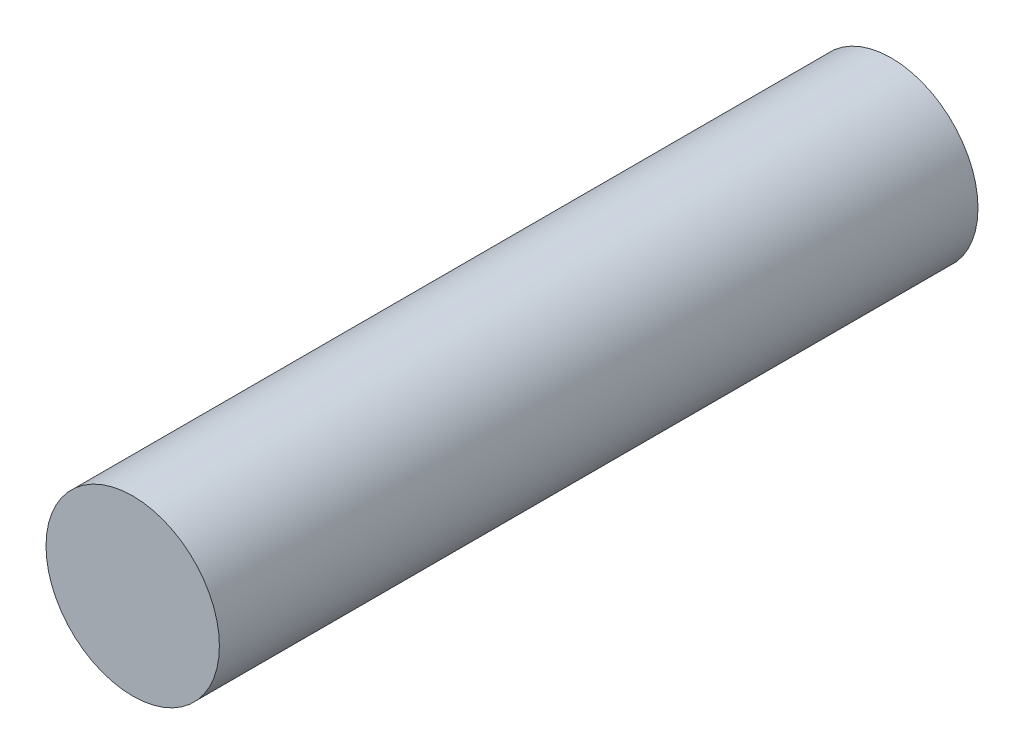
ISO-10303-21;
HEADER;
FILE_DESCRIPTION(('STEP AP214'),'2;1');
FILE_NAME('part.step','',(''),(''),'','','');
FILE_SCHEMA(('AUTOMOTIVE_DESIGN { 1 0 10303 214 1 1 1 1 }'));
ENDSEC;
DATA;
#1=APPLICATION_CONTEXT('core data for automotive mechanical design processes');
#2=APPLICATION_PROTOCOL_DEFINITION('international standard','automotive_design',2000,#1);
#3=PRODUCT_CONTEXT('',#1,'mechanical');
#4=PRODUCT('Part','Part','',(#3));
#5=PRODUCT_RELATED_PRODUCT_CATEGORY('part','',(#4));
#6=PRODUCT_DEFINITION_FORMATION('','',#4);
#7=PRODUCT_DEFINITION_CONTEXT('part definition',#1,'design');
#8=PRODUCT_DEFINITION('design','',#6,#7);
#9=PRODUCT_DEFINITION_SHAPE('','',#8);
#10=(LENGTH_UNIT() NAMED_UNIT(*) SI_UNIT(.MILLI.,.METRE.));
#11=(NAMED_UNIT(*) PLANE_ANGLE_UNIT() SI_UNIT($,.RADIAN.));
#12=(NAMED_UNIT(*) SI_UNIT($,.STERADIAN.) SOLID_ANGLE_UNIT());
#13=UNCERTAINTY_MEASURE_WITH_UNIT(LENGTH_MEASURE(1.E-05),#10,'distance_accuracy_value','');
#14=(GEOMETRIC_REPRESENTATION_CONTEXT(3) GLOBAL_UNCERTAINTY_ASSIGNED_CONTEXT((#13)) GLOBAL_UNIT_ASSIGNED_CONTEXT((#10,
#11,#12)) REPRESENTATION_CONTEXT('',''));
#15=CARTESIAN_POINT('',(0.,0.,0.));
#16=DIRECTION('',(0.,0.,1.));
#17=DIRECTION('',(1.,0.,0.));
#18=AXIS2_PLACEMENT_3D('',#15,#16,#17);
#19=CARTESIAN_POINT('',(0.,0.,35.));
#20=DIRECTION('',(0.,0.,-1.));
#21=DIRECTION('',(-1.,0.,0.));
#22=AXIS2_PLACEMENT_3D('',#19,#20,#21);
#23=CYLINDRICAL_SURFACE('',#22,4.);
#24=CARTESIAN_POINT('',(0.,0.,35.));
#25=DIRECTION('',(0.,0.,1.));
#26=DIRECTION('',(1.,0.,0.));
#27=AXIS2_PLACEMENT_3D('',#24,#25,#26);
#28=CIRCLE('',#27,4.);
#29=CARTESIAN_POINT('',(4.,0.,35.));
#30=VERTEX_POINT('',#29);
#31=EDGE_CURVE('E10',#30,#30,#28,.T.);
#32=ORIENTED_EDGE('',*,*,#31,.F.);
#33=EDGE_LOOP('',(#32));
#34=FACE_BOUND('',#33,.T.);
#35=CARTESIAN_POINT('',(0.,0.,0.));
#36=DIRECTION('',(0.,0.,1.));
#37=DIRECTION('',(1.,0.,0.));
#38=AXIS2_PLACEMENT_3D('',#35,#36,#37);
#39=CIRCLE('',#38,4.);
#40=CARTESIAN_POINT('',(4.,0.,0.));
#41=VERTEX_POINT('',#40);
#42=EDGE_CURVE('E39',#41,#41,#39,.T.);
#43=ORIENTED_EDGE('',*,*,#42,.T.);
#44=EDGE_LOOP('',(#43));
#45=FACE_BOUND('',#44,.T.);
#46=ADVANCED_FACE('F36',(#34,#45),#23,.T.);
#47=CARTESIAN_POINT('',(0.,0.,35.));
#48=DIRECTION('',(0.,0.,1.));
#49=DIRECTION('',(1.,0.,0.));
#50=AXIS2_PLACEMENT_3D('',#47,#48,#49);
#51=PLANE('',#50);
#52=ORIENTED_EDGE('',*,*,#31,.T.);
#53=EDGE_LOOP('',(#52));
#54=FACE_BOUND('',#53,.T.);
#55=ADVANCED_FACE('F51',(#54),#51,.T.);
#56=CARTESIAN_POINT('',(0.,0.,0.));
#57=DIRECTION('',(0.,0.,1.));
#58=DIRECTION('',(1.,0.,0.));
#59=AXIS2_PLACEMENT_3D('',#56,#57,#58);
#60=PLANE('',#59);
#61=ORIENTED_EDGE('',*,*,#42,.F.);
#62=EDGE_LOOP('',(#61));
#63=FACE_BOUND('',#62,.T.);
#64=ADVANCED_FACE('F49',(#63),#60,.F.);
#65=CLOSED_SHELL('',(#46,#55,#64));
#66=MANIFOLD_SOLID_BREP('B2',#65);
#67=ADVANCED_BREP_SHAPE_REPRESENTATION('',(#18,#66),#14);
#68=SHAPE_DEFINITION_REPRESENTATION(#9,#67);
ENDSEC;
END-ISO-10303-21;
